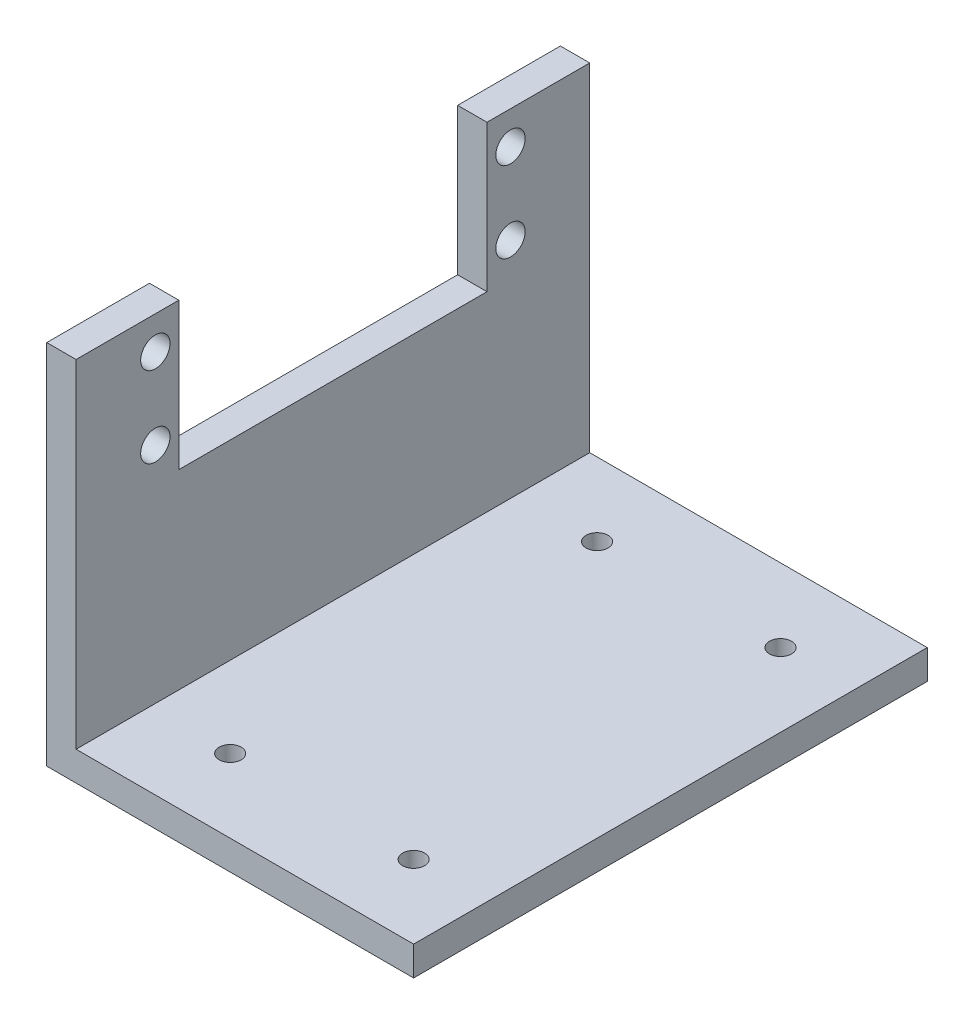
ISO-10303-21;
HEADER;
FILE_DESCRIPTION(('STEP AP214'),'2;1');
FILE_NAME('part.step','',(''),(''),'','','');
FILE_SCHEMA(('AUTOMOTIVE_DESIGN { 1 0 10303 214 1 1 1 1 }'));
ENDSEC;
DATA;
#1=APPLICATION_CONTEXT('core data for automotive mechanical design processes');
#2=APPLICATION_PROTOCOL_DEFINITION('international standard','automotive_design',2000,#1);
#3=PRODUCT_CONTEXT('',#1,'mechanical');
#4=PRODUCT('Part','Part','',(#3));
#5=PRODUCT_RELATED_PRODUCT_CATEGORY('part','',(#4));
#6=PRODUCT_DEFINITION_FORMATION('','',#4);
#7=PRODUCT_DEFINITION_CONTEXT('part definition',#1,'design');
#8=PRODUCT_DEFINITION('design','',#6,#7);
#9=PRODUCT_DEFINITION_SHAPE('','',#8);
#10=(LENGTH_UNIT() NAMED_UNIT(*) SI_UNIT(.MILLI.,.METRE.));
#11=(NAMED_UNIT(*) PLANE_ANGLE_UNIT() SI_UNIT($,.RADIAN.));
#12=(NAMED_UNIT(*) SI_UNIT($,.STERADIAN.) SOLID_ANGLE_UNIT());
#13=UNCERTAINTY_MEASURE_WITH_UNIT(LENGTH_MEASURE(1.E-05),#10,'distance_accuracy_value','');
#14=(GEOMETRIC_REPRESENTATION_CONTEXT(3) GLOBAL_UNCERTAINTY_ASSIGNED_CONTEXT((#13)) GLOBAL_UNIT_ASSIGNED_CONTEXT((#10,
#11,#12)) REPRESENTATION_CONTEXT('',''));
#15=CARTESIAN_POINT('',(0.,0.,0.));
#16=DIRECTION('',(0.,0.,1.));
#17=DIRECTION('',(1.,0.,0.));
#18=AXIS2_PLACEMENT_3D('',#15,#16,#17);
#19=CARTESIAN_POINT('',(0.,50.,70.));
#20=DIRECTION('',(0.,-1.,0.));
#21=DIRECTION('',(0.,0.,-1.));
#22=AXIS2_PLACEMENT_3D('',#19,#20,#21);
#23=PLANE('',#22);
#24=DIRECTION('',(0.,0.,-1.));
#25=VECTOR('',#24,1.);
#26=CARTESIAN_POINT('',(0.,50.,70.));
#27=LINE('',#26,#25);
#28=CARTESIAN_POINT('',(0.,50.,14.));
#29=VERTEX_POINT('',#28);
#30=CARTESIAN_POINT('',(0.,50.,0.));
#31=VERTEX_POINT('',#30);
#32=EDGE_CURVE('E85',#29,#31,#27,.T.);
#33=ORIENTED_EDGE('',*,*,#32,.F.);
#34=DIRECTION('',(1.,0.,0.));
#35=VECTOR('',#34,1.);
#36=CARTESIAN_POINT('',(0.,50.,14.));
#37=LINE('',#36,#35);
#38=CARTESIAN_POINT('',(4.,50.,14.));
#39=VERTEX_POINT('',#38);
#40=EDGE_CURVE('E161',#29,#39,#37,.T.);
#41=ORIENTED_EDGE('',*,*,#40,.T.);
#42=DIRECTION('',(0.,0.,-1.));
#43=VECTOR('',#42,1.);
#44=CARTESIAN_POINT('',(4.,50.,70.));
#45=LINE('',#44,#43);
#46=CARTESIAN_POINT('',(4.,50.,0.));
#47=VERTEX_POINT('',#46);
#48=EDGE_CURVE('E151',#39,#47,#45,.T.);
#49=ORIENTED_EDGE('',*,*,#48,.T.);
#50=DIRECTION('',(-1.,0.,0.));
#51=VECTOR('',#50,1.);
#52=CARTESIAN_POINT('',(0.,50.,0.));
#53=LINE('',#52,#51);
#54=EDGE_CURVE('E145',#47,#31,#53,.T.);
#55=ORIENTED_EDGE('',*,*,#54,.T.);
#56=EDGE_LOOP('',(#33,#41,#49,#55));
#57=FACE_BOUND('',#56,.T.);
#58=ADVANCED_FACE('F31',(#57),#23,.F.);
#59=CARTESIAN_POINT('',(0.,0.,70.));
#60=DIRECTION('',(1.,0.,0.));
#61=DIRECTION('',(0.,0.,-1.));
#62=AXIS2_PLACEMENT_3D('',#59,#60,#61);
#63=PLANE('',#62);
#64=CARTESIAN_POINT('',(0.,45.5,10.8));
#65=DIRECTION('',(-1.,0.,0.));
#66=DIRECTION('',(0.,0.,1.));
#67=AXIS2_PLACEMENT_3D('',#64,#65,#66);
#68=CIRCLE('',#67,2.);
#69=CARTESIAN_POINT('',(0.,45.5,12.8));
#70=VERTEX_POINT('',#69);
#71=EDGE_CURVE('E195',#70,#70,#68,.T.);
#72=ORIENTED_EDGE('',*,*,#71,.F.);
#73=EDGE_LOOP('',(#72));
#74=FACE_BOUND('',#73,.T.);
#75=CARTESIAN_POINT('',(0.,34.5,10.8));
#76=DIRECTION('',(-1.,0.,0.));
#77=DIRECTION('',(0.,0.,1.));
#78=AXIS2_PLACEMENT_3D('',#75,#76,#77);
#79=CIRCLE('',#78,2.);
#80=CARTESIAN_POINT('',(0.,34.5,12.8));
#81=VERTEX_POINT('',#80);
#82=EDGE_CURVE('E185',#81,#81,#79,.T.);
#83=ORIENTED_EDGE('',*,*,#82,.F.);
#84=EDGE_LOOP('',(#83));
#85=FACE_BOUND('',#84,.T.);
#86=CARTESIAN_POINT('',(0.,34.5,59.2));
#87=DIRECTION('',(-1.,0.,0.));
#88=DIRECTION('',(0.,0.,1.));
#89=AXIS2_PLACEMENT_3D('',#86,#87,#88);
#90=CIRCLE('',#89,2.);
#91=CARTESIAN_POINT('',(0.,34.5,61.2));
#92=VERTEX_POINT('',#91);
#93=EDGE_CURVE('E182',#92,#92,#90,.T.);
#94=ORIENTED_EDGE('',*,*,#93,.F.);
#95=EDGE_LOOP('',(#94));
#96=FACE_BOUND('',#95,.T.);
#97=CARTESIAN_POINT('',(0.,45.5,59.2));
#98=DIRECTION('',(-1.,0.,0.));
#99=DIRECTION('',(0.,0.,1.));
#100=AXIS2_PLACEMENT_3D('',#97,#98,#99);
#101=CIRCLE('',#100,2.);
#102=CARTESIAN_POINT('',(0.,45.5,61.2));
#103=VERTEX_POINT('',#102);
#104=EDGE_CURVE('E179',#103,#103,#101,.T.);
#105=ORIENTED_EDGE('',*,*,#104,.F.);
#106=EDGE_LOOP('',(#105));
#107=FACE_BOUND('',#106,.T.);
#108=DIRECTION('',(0.,0.,1.));
#109=VECTOR('',#108,1.);
#110=CARTESIAN_POINT('',(0.,30.,14.));
#111=LINE('',#110,#109);
#112=CARTESIAN_POINT('',(0.,30.,14.));
#113=VERTEX_POINT('',#112);
#114=CARTESIAN_POINT('',(0.,30.,56.));
#115=VERTEX_POINT('',#114);
#116=EDGE_CURVE('E214',#113,#115,#111,.T.);
#117=ORIENTED_EDGE('',*,*,#116,.F.);
#118=DIRECTION('',(0.,-1.,0.));
#119=VECTOR('',#118,1.);
#120=CARTESIAN_POINT('',(0.,50.,14.));
#121=LINE('',#120,#119);
#122=EDGE_CURVE('E209',#29,#113,#121,.T.);
#123=ORIENTED_EDGE('',*,*,#122,.F.);
#124=ORIENTED_EDGE('',*,*,#32,.T.);
#125=DIRECTION('',(0.,-1.,0.));
#126=VECTOR('',#125,1.);
#127=CARTESIAN_POINT('',(0.,0.,0.));
#128=LINE('',#127,#126);
#129=CARTESIAN_POINT('',(0.,0.,0.));
#130=VERTEX_POINT('',#129);
#131=EDGE_CURVE('E135',#31,#130,#128,.T.);
#132=ORIENTED_EDGE('',*,*,#131,.T.);
#133=DIRECTION('',(0.,0.,-1.));
#134=VECTOR('',#133,1.);
#135=CARTESIAN_POINT('',(0.,0.,70.));
#136=LINE('',#135,#134);
#137=CARTESIAN_POINT('',(0.,0.,70.));
#138=VERTEX_POINT('',#137);
#139=EDGE_CURVE('E157',#138,#130,#136,.T.);
#140=ORIENTED_EDGE('',*,*,#139,.F.);
#141=DIRECTION('',(0.,-1.,0.));
#142=VECTOR('',#141,1.);
#143=CARTESIAN_POINT('',(0.,0.,70.));
#144=LINE('',#143,#142);
#145=CARTESIAN_POINT('',(0.,50.,70.));
#146=VERTEX_POINT('',#145);
#147=EDGE_CURVE('E147',#146,#138,#144,.T.);
#148=ORIENTED_EDGE('',*,*,#147,.F.);
#149=CARTESIAN_POINT('',(0.,50.,56.));
#150=VERTEX_POINT('',#149);
#151=EDGE_CURVE('E148',#146,#150,#27,.T.);
#152=ORIENTED_EDGE('',*,*,#151,.T.);
#153=DIRECTION('',(0.,1.,0.));
#154=VECTOR('',#153,1.);
#155=CARTESIAN_POINT('',(0.,50.,56.));
#156=LINE('',#155,#154);
#157=EDGE_CURVE('E48',#115,#150,#156,.T.);
#158=ORIENTED_EDGE('',*,*,#157,.F.);
#159=EDGE_LOOP('',(#117,#123,#124,#132,#140,#148,#152,#158));
#160=FACE_BOUND('',#159,.T.);
#161=ADVANCED_FACE('F253',(#74,#85,#96,#107,#160),#63,.F.);
#162=CARTESIAN_POINT('',(4.,0.,70.));
#163=DIRECTION('',(0.,1.,0.));
#164=DIRECTION('',(0.,0.,1.));
#165=AXIS2_PLACEMENT_3D('',#162,#163,#164);
#166=PLANE('',#165);
#167=CARTESIAN_POINT('',(40.,0.,10.));
#168=DIRECTION('',(0.,1.,0.));
#169=DIRECTION('',(0.,0.,1.));
#170=AXIS2_PLACEMENT_3D('',#167,#168,#169);
#171=CIRCLE('',#170,1.5);
#172=CARTESIAN_POINT('',(40.,0.,11.5));
#173=VERTEX_POINT('',#172);
#174=EDGE_CURVE('E178',#173,#173,#171,.T.);
#175=ORIENTED_EDGE('',*,*,#174,.T.);
#176=EDGE_LOOP('',(#175));
#177=FACE_BOUND('',#176,.T.);
#178=CARTESIAN_POINT('',(40.,0.,60.));
#179=DIRECTION('',(0.,1.,0.));
#180=DIRECTION('',(0.,0.,1.));
#181=AXIS2_PLACEMENT_3D('',#178,#179,#180);
#182=CIRCLE('',#181,1.5);
#183=CARTESIAN_POINT('',(40.,0.,61.5));
#184=VERTEX_POINT('',#183);
#185=EDGE_CURVE('E206',#184,#184,#182,.T.);
#186=ORIENTED_EDGE('',*,*,#185,.T.);
#187=EDGE_LOOP('',(#186));
#188=FACE_BOUND('',#187,.T.);
#189=DIRECTION('',(1.,0.,0.));
#190=VECTOR('',#189,1.);
#191=CARTESIAN_POINT('',(4.,0.,0.));
#192=LINE('',#191,#190);
#193=CARTESIAN_POINT('',(50.,0.,0.));
#194=VERTEX_POINT('',#193);
#195=EDGE_CURVE('E137',#130,#194,#192,.T.);
#196=ORIENTED_EDGE('',*,*,#195,.T.);
#197=DIRECTION('',(0.,0.,-1.));
#198=VECTOR('',#197,1.);
#199=CARTESIAN_POINT('',(50.,0.,70.));
#200=LINE('',#199,#198);
#201=CARTESIAN_POINT('',(50.,0.,70.));
#202=VERTEX_POINT('',#201);
#203=EDGE_CURVE('E154',#202,#194,#200,.T.);
#204=ORIENTED_EDGE('',*,*,#203,.F.);
#205=DIRECTION('',(1.,0.,0.));
#206=VECTOR('',#205,1.);
#207=CARTESIAN_POINT('',(0.,0.,70.));
#208=LINE('',#207,#206);
#209=EDGE_CURVE('E94',#138,#202,#208,.T.);
#210=ORIENTED_EDGE('',*,*,#209,.F.);
#211=ORIENTED_EDGE('',*,*,#139,.T.);
#212=EDGE_LOOP('',(#196,#204,#210,#211));
#213=FACE_BOUND('',#212,.T.);
#214=CARTESIAN_POINT('',(15.,0.,60.));
#215=DIRECTION('',(0.,1.,0.));
#216=DIRECTION('',(0.,0.,1.));
#217=AXIS2_PLACEMENT_3D('',#214,#215,#216);
#218=CIRCLE('',#217,1.5);
#219=CARTESIAN_POINT('',(15.,0.,61.5));
#220=VERTEX_POINT('',#219);
#221=EDGE_CURVE('E167',#220,#220,#218,.T.);
#222=ORIENTED_EDGE('',*,*,#221,.T.);
#223=EDGE_LOOP('',(#222));
#224=FACE_BOUND('',#223,.T.);
#225=CARTESIAN_POINT('',(15.,0.,10.));
#226=DIRECTION('',(0.,1.,0.));
#227=DIRECTION('',(0.,0.,1.));
#228=AXIS2_PLACEMENT_3D('',#225,#226,#227);
#229=CIRCLE('',#228,1.5);
#230=CARTESIAN_POINT('',(15.,0.,11.5));
#231=VERTEX_POINT('',#230);
#232=EDGE_CURVE('E40',#231,#231,#229,.T.);
#233=ORIENTED_EDGE('',*,*,#232,.T.);
#234=EDGE_LOOP('',(#233));
#235=FACE_BOUND('',#234,.T.);
#236=ADVANCED_FACE('F230',(#177,#188,#213,#224,#235),#166,.F.);
#237=CARTESIAN_POINT('',(50.,0.,70.));
#238=DIRECTION('',(-1.,0.,0.));
#239=DIRECTION('',(0.,0.,1.));
#240=AXIS2_PLACEMENT_3D('',#237,#238,#239);
#241=PLANE('',#240);
#242=DIRECTION('',(0.,1.,0.));
#243=VECTOR('',#242,1.);
#244=CARTESIAN_POINT('',(50.,0.,0.));
#245=LINE('',#244,#243);
#246=CARTESIAN_POINT('',(50.,4.,0.));
#247=VERTEX_POINT('',#246);
#248=EDGE_CURVE('E140',#194,#247,#245,.T.);
#249=ORIENTED_EDGE('',*,*,#248,.T.);
#250=DIRECTION('',(0.,0.,-1.));
#251=VECTOR('',#250,1.);
#252=CARTESIAN_POINT('',(50.,4.,70.));
#253=LINE('',#252,#251);
#254=CARTESIAN_POINT('',(50.,4.,70.));
#255=VERTEX_POINT('',#254);
#256=EDGE_CURVE('E124',#255,#247,#253,.T.);
#257=ORIENTED_EDGE('',*,*,#256,.F.);
#258=DIRECTION('',(0.,1.,0.));
#259=VECTOR('',#258,1.);
#260=CARTESIAN_POINT('',(50.,0.,70.));
#261=LINE('',#260,#259);
#262=EDGE_CURVE('E110',#202,#255,#261,.T.);
#263=ORIENTED_EDGE('',*,*,#262,.F.);
#264=ORIENTED_EDGE('',*,*,#203,.T.);
#265=EDGE_LOOP('',(#249,#257,#263,#264));
#266=FACE_BOUND('',#265,.T.);
#267=ADVANCED_FACE('F234',(#266),#241,.F.);
#268=CARTESIAN_POINT('',(4.,4.,70.));
#269=DIRECTION('',(0.,-1.,0.));
#270=DIRECTION('',(0.,0.,-1.));
#271=AXIS2_PLACEMENT_3D('',#268,#269,#270);
#272=PLANE('',#271);
#273=CARTESIAN_POINT('',(40.,4.,10.));
#274=DIRECTION('',(0.,1.,0.));
#275=DIRECTION('',(0.,0.,1.));
#276=AXIS2_PLACEMENT_3D('',#273,#274,#275);
#277=CIRCLE('',#276,1.5);
#278=CARTESIAN_POINT('',(40.,4.,11.5));
#279=VERTEX_POINT('',#278);
#280=EDGE_CURVE('E202',#279,#279,#277,.T.);
#281=ORIENTED_EDGE('',*,*,#280,.F.);
#282=EDGE_LOOP('',(#281));
#283=FACE_BOUND('',#282,.T.);
#284=CARTESIAN_POINT('',(40.,4.,60.));
#285=DIRECTION('',(0.,1.,0.));
#286=DIRECTION('',(0.,0.,1.));
#287=AXIS2_PLACEMENT_3D('',#284,#285,#286);
#288=CIRCLE('',#287,1.5);
#289=CARTESIAN_POINT('',(40.,4.,61.5));
#290=VERTEX_POINT('',#289);
#291=EDGE_CURVE('E205',#290,#290,#288,.T.);
#292=ORIENTED_EDGE('',*,*,#291,.F.);
#293=EDGE_LOOP('',(#292));
#294=FACE_BOUND('',#293,.T.);
#295=DIRECTION('',(-1.,0.,0.));
#296=VECTOR('',#295,1.);
#297=CARTESIAN_POINT('',(4.,4.,0.));
#298=LINE('',#297,#296);
#299=CARTESIAN_POINT('',(4.,4.,0.));
#300=VERTEX_POINT('',#299);
#301=EDGE_CURVE('E120',#247,#300,#298,.T.);
#302=ORIENTED_EDGE('',*,*,#301,.T.);
#303=DIRECTION('',(0.,0.,-1.));
#304=VECTOR('',#303,1.);
#305=CARTESIAN_POINT('',(4.,4.,70.));
#306=LINE('',#305,#304);
#307=CARTESIAN_POINT('',(4.,4.,70.));
#308=VERTEX_POINT('',#307);
#309=EDGE_CURVE('E116',#308,#300,#306,.T.);
#310=ORIENTED_EDGE('',*,*,#309,.F.);
#311=DIRECTION('',(-1.,0.,0.));
#312=VECTOR('',#311,1.);
#313=CARTESIAN_POINT('',(4.,4.,70.));
#314=LINE('',#313,#312);
#315=EDGE_CURVE('E103',#255,#308,#314,.T.);
#316=ORIENTED_EDGE('',*,*,#315,.F.);
#317=ORIENTED_EDGE('',*,*,#256,.T.);
#318=EDGE_LOOP('',(#302,#310,#316,#317));
#319=FACE_BOUND('',#318,.T.);
#320=CARTESIAN_POINT('',(15.,4.,60.));
#321=DIRECTION('',(0.,1.,0.));
#322=DIRECTION('',(0.,0.,1.));
#323=AXIS2_PLACEMENT_3D('',#320,#321,#322);
#324=CIRCLE('',#323,1.5);
#325=CARTESIAN_POINT('',(15.,4.,61.5));
#326=VERTEX_POINT('',#325);
#327=EDGE_CURVE('E170',#326,#326,#324,.T.);
#328=ORIENTED_EDGE('',*,*,#327,.F.);
#329=EDGE_LOOP('',(#328));
#330=FACE_BOUND('',#329,.T.);
#331=CARTESIAN_POINT('',(15.,4.,10.));
#332=DIRECTION('',(0.,1.,0.));
#333=DIRECTION('',(0.,0.,1.));
#334=AXIS2_PLACEMENT_3D('',#331,#332,#333);
#335=CIRCLE('',#334,1.5);
#336=CARTESIAN_POINT('',(15.,4.,11.5));
#337=VERTEX_POINT('',#336);
#338=EDGE_CURVE('E11',#337,#337,#335,.T.);
#339=ORIENTED_EDGE('',*,*,#338,.F.);
#340=EDGE_LOOP('',(#339));
#341=FACE_BOUND('',#340,.T.);
#342=ADVANCED_FACE('F117',(#283,#294,#319,#330,#341),#272,.F.);
#343=CARTESIAN_POINT('',(4.,4.,70.));
#344=DIRECTION('',(-1.,0.,0.));
#345=DIRECTION('',(0.,0.,1.));
#346=AXIS2_PLACEMENT_3D('',#343,#344,#345);
#347=PLANE('',#346);
#348=CARTESIAN_POINT('',(4.,45.5,10.8));
#349=DIRECTION('',(-1.,0.,0.));
#350=DIRECTION('',(0.,0.,1.));
#351=AXIS2_PLACEMENT_3D('',#348,#349,#350);
#352=CIRCLE('',#351,2.);
#353=CARTESIAN_POINT('',(4.,45.5,12.8));
#354=VERTEX_POINT('',#353);
#355=EDGE_CURVE('E35',#354,#354,#352,.T.);
#356=ORIENTED_EDGE('',*,*,#355,.T.);
#357=EDGE_LOOP('',(#356));
#358=FACE_BOUND('',#357,.T.);
#359=CARTESIAN_POINT('',(4.,34.5,10.8));
#360=DIRECTION('',(-1.,0.,0.));
#361=DIRECTION('',(0.,0.,1.));
#362=AXIS2_PLACEMENT_3D('',#359,#360,#361);
#363=CIRCLE('',#362,2.);
#364=CARTESIAN_POINT('',(4.,34.5,12.8));
#365=VERTEX_POINT('',#364);
#366=EDGE_CURVE('E183',#365,#365,#363,.T.);
#367=ORIENTED_EDGE('',*,*,#366,.T.);
#368=EDGE_LOOP('',(#367));
#369=FACE_BOUND('',#368,.T.);
#370=CARTESIAN_POINT('',(4.,34.5,59.2));
#371=DIRECTION('',(-1.,0.,0.));
#372=DIRECTION('',(0.,0.,1.));
#373=AXIS2_PLACEMENT_3D('',#370,#371,#372);
#374=CIRCLE('',#373,2.);
#375=CARTESIAN_POINT('',(4.,34.5,61.2));
#376=VERTEX_POINT('',#375);
#377=EDGE_CURVE('E180',#376,#376,#374,.T.);
#378=ORIENTED_EDGE('',*,*,#377,.T.);
#379=EDGE_LOOP('',(#378));
#380=FACE_BOUND('',#379,.T.);
#381=CARTESIAN_POINT('',(4.,45.5,59.2));
#382=DIRECTION('',(-1.,0.,0.));
#383=DIRECTION('',(0.,0.,1.));
#384=AXIS2_PLACEMENT_3D('',#381,#382,#383);
#385=CIRCLE('',#384,2.);
#386=CARTESIAN_POINT('',(4.,45.5,61.2));
#387=VERTEX_POINT('',#386);
#388=EDGE_CURVE('E175',#387,#387,#385,.T.);
#389=ORIENTED_EDGE('',*,*,#388,.T.);
#390=EDGE_LOOP('',(#389));
#391=FACE_BOUND('',#390,.T.);
#392=ORIENTED_EDGE('',*,*,#48,.F.);
#393=DIRECTION('',(0.,-1.,0.));
#394=VECTOR('',#393,1.);
#395=CARTESIAN_POINT('',(4.,3.99999999999999,14.));
#396=LINE('',#395,#394);
#397=CARTESIAN_POINT('',(4.,30.,14.));
#398=VERTEX_POINT('',#397);
#399=EDGE_CURVE('E138',#39,#398,#396,.T.);
#400=ORIENTED_EDGE('',*,*,#399,.T.);
#401=DIRECTION('',(0.,0.,1.));
#402=VECTOR('',#401,1.);
#403=CARTESIAN_POINT('',(4.,30.,70.));
#404=LINE('',#403,#402);
#405=CARTESIAN_POINT('',(4.,30.,56.));
#406=VERTEX_POINT('',#405);
#407=EDGE_CURVE('E164',#398,#406,#404,.T.);
#408=ORIENTED_EDGE('',*,*,#407,.T.);
#409=DIRECTION('',(0.,1.,0.));
#410=VECTOR('',#409,1.);
#411=CARTESIAN_POINT('',(4.,3.99999999999999,56.));
#412=LINE('',#411,#410);
#413=CARTESIAN_POINT('',(4.,50.,56.));
#414=VERTEX_POINT('',#413);
#415=EDGE_CURVE('E221',#406,#414,#412,.T.);
#416=ORIENTED_EDGE('',*,*,#415,.T.);
#417=CARTESIAN_POINT('',(4.,50.,70.));
#418=VERTEX_POINT('',#417);
#419=EDGE_CURVE('E125',#418,#414,#45,.T.);
#420=ORIENTED_EDGE('',*,*,#419,.F.);
#421=DIRECTION('',(0.,1.,0.));
#422=VECTOR('',#421,1.);
#423=CARTESIAN_POINT('',(4.,4.,70.));
#424=LINE('',#423,#422);
#425=EDGE_CURVE('E107',#308,#418,#424,.T.);
#426=ORIENTED_EDGE('',*,*,#425,.F.);
#427=ORIENTED_EDGE('',*,*,#309,.T.);
#428=DIRECTION('',(0.,1.,0.));
#429=VECTOR('',#428,1.);
#430=CARTESIAN_POINT('',(4.,4.,0.));
#431=LINE('',#430,#429);
#432=EDGE_CURVE('E143',#300,#47,#431,.T.);
#433=ORIENTED_EDGE('',*,*,#432,.T.);
#434=EDGE_LOOP('',(#392,#400,#408,#416,#420,#426,#427,#433));
#435=FACE_BOUND('',#434,.T.);
#436=ADVANCED_FACE('F128',(#358,#369,#380,#391,#435),#347,.F.);
#437=ORIENTED_EDGE('',*,*,#419,.T.);
#438=DIRECTION('',(-1.,0.,0.));
#439=VECTOR('',#438,1.);
#440=CARTESIAN_POINT('',(0.,50.,56.));
#441=LINE('',#440,#439);
#442=EDGE_CURVE('E159',#414,#150,#441,.T.);
#443=ORIENTED_EDGE('',*,*,#442,.T.);
#444=ORIENTED_EDGE('',*,*,#151,.F.);
#445=DIRECTION('',(-1.,0.,0.));
#446=VECTOR('',#445,1.);
#447=CARTESIAN_POINT('',(0.,50.,70.));
#448=LINE('',#447,#446);
#449=EDGE_CURVE('E57',#418,#146,#448,.T.);
#450=ORIENTED_EDGE('',*,*,#449,.F.);
#451=EDGE_LOOP('',(#437,#443,#444,#450));
#452=FACE_BOUND('',#451,.T.);
#453=ADVANCED_FACE('F265',(#452),#23,.F.);
#454=CARTESIAN_POINT('',(0.,50.,70.));
#455=DIRECTION('',(0.,0.,-1.));
#456=DIRECTION('',(-1.,0.,0.));
#457=AXIS2_PLACEMENT_3D('',#454,#455,#456);
#458=PLANE('',#457);
#459=ORIENTED_EDGE('',*,*,#147,.T.);
#460=ORIENTED_EDGE('',*,*,#209,.T.);
#461=ORIENTED_EDGE('',*,*,#262,.T.);
#462=ORIENTED_EDGE('',*,*,#315,.T.);
#463=ORIENTED_EDGE('',*,*,#425,.T.);
#464=ORIENTED_EDGE('',*,*,#449,.T.);
#465=EDGE_LOOP('',(#459,#460,#461,#462,#463,#464));
#466=FACE_BOUND('',#465,.T.);
#467=ADVANCED_FACE('F105',(#466),#458,.F.);
#468=CARTESIAN_POINT('',(0.,50.,0.));
#469=DIRECTION('',(0.,0.,-1.));
#470=DIRECTION('',(-1.,0.,0.));
#471=AXIS2_PLACEMENT_3D('',#468,#469,#470);
#472=PLANE('',#471);
#473=ORIENTED_EDGE('',*,*,#131,.F.);
#474=ORIENTED_EDGE('',*,*,#54,.F.);
#475=ORIENTED_EDGE('',*,*,#432,.F.);
#476=ORIENTED_EDGE('',*,*,#301,.F.);
#477=ORIENTED_EDGE('',*,*,#248,.F.);
#478=ORIENTED_EDGE('',*,*,#195,.F.);
#479=EDGE_LOOP('',(#473,#474,#475,#476,#477,#478));
#480=FACE_BOUND('',#479,.T.);
#481=ADVANCED_FACE('F237',(#480),#472,.T.);
#482=CARTESIAN_POINT('',(70.,30.,14.));
#483=DIRECTION('',(0.,-1.,0.));
#484=DIRECTION('',(0.,0.,-1.));
#485=AXIS2_PLACEMENT_3D('',#482,#483,#484);
#486=PLANE('',#485);
#487=DIRECTION('',(-1.,0.,0.));
#488=VECTOR('',#487,1.);
#489=CARTESIAN_POINT('',(70.,30.,14.));
#490=LINE('',#489,#488);
#491=EDGE_CURVE('E218',#398,#113,#490,.T.);
#492=ORIENTED_EDGE('',*,*,#491,.T.);
#493=ORIENTED_EDGE('',*,*,#116,.T.);
#494=DIRECTION('',(-1.,0.,0.));
#495=VECTOR('',#494,1.);
#496=CARTESIAN_POINT('',(70.,30.,56.));
#497=LINE('',#496,#495);
#498=EDGE_CURVE('E219',#406,#115,#497,.T.);
#499=ORIENTED_EDGE('',*,*,#498,.F.);
#500=ORIENTED_EDGE('',*,*,#407,.F.);
#501=EDGE_LOOP('',(#492,#493,#499,#500));
#502=FACE_BOUND('',#501,.T.);
#503=ADVANCED_FACE('F257',(#502),#486,.F.);
#504=CARTESIAN_POINT('',(70.,50.,14.));
#505=DIRECTION('',(0.,0.,-1.));
#506=DIRECTION('',(0.,1.,0.));
#507=AXIS2_PLACEMENT_3D('',#504,#505,#506);
#508=PLANE('',#507);
#509=ORIENTED_EDGE('',*,*,#40,.F.);
#510=ORIENTED_EDGE('',*,*,#122,.T.);
#511=ORIENTED_EDGE('',*,*,#491,.F.);
#512=ORIENTED_EDGE('',*,*,#399,.F.);
#513=EDGE_LOOP('',(#509,#510,#511,#512));
#514=FACE_BOUND('',#513,.T.);
#515=ADVANCED_FACE('F246',(#514),#508,.F.);
#516=CARTESIAN_POINT('',(70.,50.,56.));
#517=DIRECTION('',(0.,0.,1.));
#518=DIRECTION('',(0.,-1.,0.));
#519=AXIS2_PLACEMENT_3D('',#516,#517,#518);
#520=PLANE('',#519);
#521=ORIENTED_EDGE('',*,*,#498,.T.);
#522=ORIENTED_EDGE('',*,*,#157,.T.);
#523=ORIENTED_EDGE('',*,*,#442,.F.);
#524=ORIENTED_EDGE('',*,*,#415,.F.);
#525=EDGE_LOOP('',(#521,#522,#523,#524));
#526=FACE_BOUND('',#525,.T.);
#527=ADVANCED_FACE('F263',(#526),#520,.F.);
#528=CARTESIAN_POINT('',(40.,0.,60.));
#529=DIRECTION('',(0.,1.,0.));
#530=DIRECTION('',(0.,0.,1.));
#531=AXIS2_PLACEMENT_3D('',#528,#529,#530);
#532=CYLINDRICAL_SURFACE('',#531,1.5);
#533=ORIENTED_EDGE('',*,*,#185,.F.);
#534=EDGE_LOOP('',(#533));
#535=FACE_BOUND('',#534,.T.);
#536=ORIENTED_EDGE('',*,*,#291,.T.);
#537=EDGE_LOOP('',(#536));
#538=FACE_BOUND('',#537,.T.);
#539=ADVANCED_FACE('F302',(#535,#538),#532,.F.);
#540=CARTESIAN_POINT('',(40.,0.,10.));
#541=DIRECTION('',(0.,1.,0.));
#542=DIRECTION('',(0.,0.,1.));
#543=AXIS2_PLACEMENT_3D('',#540,#541,#542);
#544=CYLINDRICAL_SURFACE('',#543,1.5);
#545=ORIENTED_EDGE('',*,*,#174,.F.);
#546=EDGE_LOOP('',(#545));
#547=FACE_BOUND('',#546,.T.);
#548=ORIENTED_EDGE('',*,*,#280,.T.);
#549=EDGE_LOOP('',(#548));
#550=FACE_BOUND('',#549,.T.);
#551=ADVANCED_FACE('F294',(#547,#550),#544,.F.);
#552=CARTESIAN_POINT('',(15.,0.,60.));
#553=DIRECTION('',(0.,1.,0.));
#554=DIRECTION('',(0.,0.,1.));
#555=AXIS2_PLACEMENT_3D('',#552,#553,#554);
#556=CYLINDRICAL_SURFACE('',#555,1.5);
#557=ORIENTED_EDGE('',*,*,#221,.F.);
#558=EDGE_LOOP('',(#557));
#559=FACE_BOUND('',#558,.T.);
#560=ORIENTED_EDGE('',*,*,#327,.T.);
#561=EDGE_LOOP('',(#560));
#562=FACE_BOUND('',#561,.T.);
#563=ADVANCED_FACE('F292',(#559,#562),#556,.F.);
#564=CARTESIAN_POINT('',(15.,0.,10.));
#565=DIRECTION('',(0.,1.,0.));
#566=DIRECTION('',(0.,0.,1.));
#567=AXIS2_PLACEMENT_3D('',#564,#565,#566);
#568=CYLINDRICAL_SURFACE('',#567,1.5);
#569=ORIENTED_EDGE('',*,*,#232,.F.);
#570=EDGE_LOOP('',(#569));
#571=FACE_BOUND('',#570,.T.);
#572=ORIENTED_EDGE('',*,*,#338,.T.);
#573=EDGE_LOOP('',(#572));
#574=FACE_BOUND('',#573,.T.);
#575=ADVANCED_FACE('F33',(#571,#574),#568,.F.);
#576=CARTESIAN_POINT('',(10.,45.5,59.2));
#577=DIRECTION('',(-1.,0.,0.));
#578=DIRECTION('',(0.,0.,1.));
#579=AXIS2_PLACEMENT_3D('',#576,#577,#578);
#580=CYLINDRICAL_SURFACE('',#579,2.);
#581=ORIENTED_EDGE('',*,*,#104,.T.);
#582=EDGE_LOOP('',(#581));
#583=FACE_BOUND('',#582,.T.);
#584=ORIENTED_EDGE('',*,*,#388,.F.);
#585=EDGE_LOOP('',(#584));
#586=FACE_BOUND('',#585,.T.);
#587=ADVANCED_FACE('F300',(#583,#586),#580,.F.);
#588=CARTESIAN_POINT('',(10.,34.5,59.2));
#589=DIRECTION('',(-1.,0.,0.));
#590=DIRECTION('',(0.,0.,1.));
#591=AXIS2_PLACEMENT_3D('',#588,#589,#590);
#592=CYLINDRICAL_SURFACE('',#591,2.);
#593=ORIENTED_EDGE('',*,*,#93,.T.);
#594=EDGE_LOOP('',(#593));
#595=FACE_BOUND('',#594,.T.);
#596=ORIENTED_EDGE('',*,*,#377,.F.);
#597=EDGE_LOOP('',(#596));
#598=FACE_BOUND('',#597,.T.);
#599=ADVANCED_FACE('F393',(#595,#598),#592,.F.);
#600=CARTESIAN_POINT('',(10.,34.5,10.8));
#601=DIRECTION('',(-1.,0.,0.));
#602=DIRECTION('',(0.,0.,1.));
#603=AXIS2_PLACEMENT_3D('',#600,#601,#602);
#604=CYLINDRICAL_SURFACE('',#603,2.);
#605=ORIENTED_EDGE('',*,*,#82,.T.);
#606=EDGE_LOOP('',(#605));
#607=FACE_BOUND('',#606,.T.);
#608=ORIENTED_EDGE('',*,*,#366,.F.);
#609=EDGE_LOOP('',(#608));
#610=FACE_BOUND('',#609,.T.);
#611=ADVANCED_FACE('F401',(#607,#610),#604,.F.);
#612=CARTESIAN_POINT('',(10.,45.5,10.8));
#613=DIRECTION('',(-1.,0.,0.));
#614=DIRECTION('',(0.,0.,1.));
#615=AXIS2_PLACEMENT_3D('',#612,#613,#614);
#616=CYLINDRICAL_SURFACE('',#615,2.);
#617=ORIENTED_EDGE('',*,*,#71,.T.);
#618=EDGE_LOOP('',(#617));
#619=FACE_BOUND('',#618,.T.);
#620=ORIENTED_EDGE('',*,*,#355,.F.);
#621=EDGE_LOOP('',(#620));
#622=FACE_BOUND('',#621,.T.);
#623=ADVANCED_FACE('F410',(#619,#622),#616,.F.);
#624=CLOSED_SHELL('',(#58,#161,#236,#267,#342,#436,#453,#467,#481,#503,#515,#527,#539,#551,#563,
#575,#587,#599,#611,#623));
#625=MANIFOLD_SOLID_BREP('B2',#624);
#626=ADVANCED_BREP_SHAPE_REPRESENTATION('',(#18,#625),#14);
#627=SHAPE_DEFINITION_REPRESENTATION(#9,#626);
ENDSEC;
END-ISO-10303-21;
